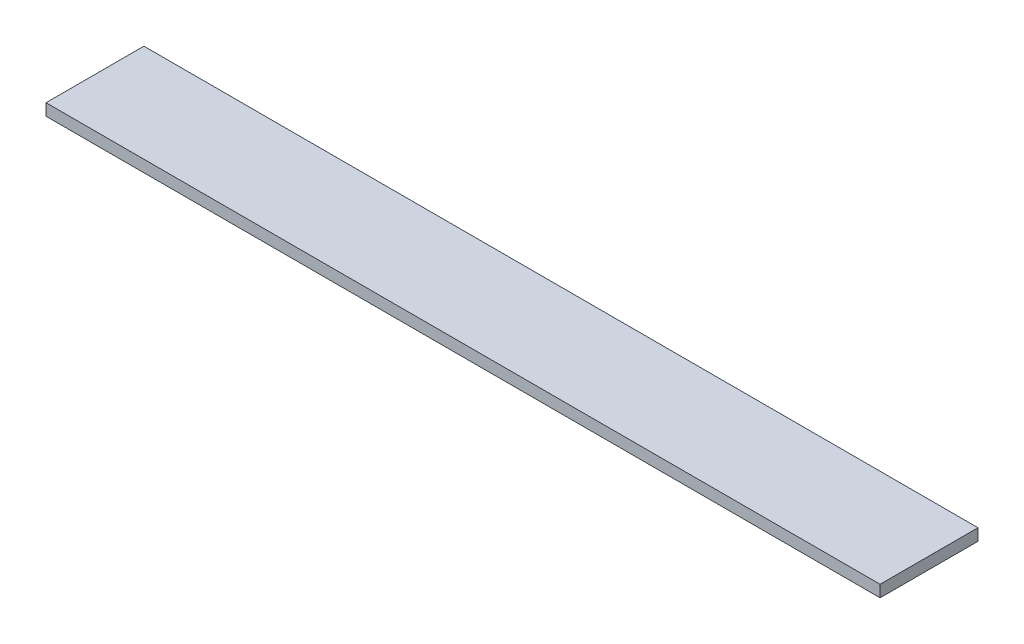
ISO-10303-21;
HEADER;
FILE_DESCRIPTION(('STEP AP214'),'2;1');
FILE_NAME('part.step','',(''),(''),'','','');
FILE_SCHEMA(('AUTOMOTIVE_DESIGN { 1 0 10303 214 1 1 1 1 }'));
ENDSEC;
DATA;
#1=APPLICATION_CONTEXT('core data for automotive mechanical design processes');
#2=APPLICATION_PROTOCOL_DEFINITION('international standard','automotive_design',2000,#1);
#3=PRODUCT_CONTEXT('',#1,'mechanical');
#4=PRODUCT('Part','Part','',(#3));
#5=PRODUCT_RELATED_PRODUCT_CATEGORY('part','',(#4));
#6=PRODUCT_DEFINITION_FORMATION('','',#4);
#7=PRODUCT_DEFINITION_CONTEXT('part definition',#1,'design');
#8=PRODUCT_DEFINITION('design','',#6,#7);
#9=PRODUCT_DEFINITION_SHAPE('','',#8);
#10=(LENGTH_UNIT() NAMED_UNIT(*) SI_UNIT(.MILLI.,.METRE.));
#11=(NAMED_UNIT(*) PLANE_ANGLE_UNIT() SI_UNIT($,.RADIAN.));
#12=(NAMED_UNIT(*) SI_UNIT($,.STERADIAN.) SOLID_ANGLE_UNIT());
#13=UNCERTAINTY_MEASURE_WITH_UNIT(LENGTH_MEASURE(1.E-05),#10,'distance_accuracy_value','');
#14=(GEOMETRIC_REPRESENTATION_CONTEXT(3) GLOBAL_UNCERTAINTY_ASSIGNED_CONTEXT((#13)) GLOBAL_UNIT_ASSIGNED_CONTEXT((#10,
#11,#12)) REPRESENTATION_CONTEXT('',''));
#15=CARTESIAN_POINT('',(0.,0.,0.));
#16=DIRECTION('',(0.,0.,1.));
#17=DIRECTION('',(1.,0.,0.));
#18=AXIS2_PLACEMENT_3D('',#15,#16,#17);
#19=CARTESIAN_POINT('',(135.255,3.81,-15.875));
#20=DIRECTION('',(-1.,0.,0.));
#21=DIRECTION('',(0.,0.,1.));
#22=AXIS2_PLACEMENT_3D('',#19,#20,#21);
#23=PLANE('',#22);
#24=DIRECTION('',(0.,0.,-1.));
#25=VECTOR('',#24,1.);
#26=CARTESIAN_POINT('',(135.255,0.,-15.875));
#27=LINE('',#26,#25);
#28=CARTESIAN_POINT('',(135.255,0.,15.875));
#29=VERTEX_POINT('',#28);
#30=CARTESIAN_POINT('',(135.255,0.,-15.875));
#31=VERTEX_POINT('',#30);
#32=EDGE_CURVE('E100',#29,#31,#27,.T.);
#33=ORIENTED_EDGE('',*,*,#32,.T.);
#34=DIRECTION('',(0.,-1.,0.));
#35=VECTOR('',#34,1.);
#36=CARTESIAN_POINT('',(135.255,3.81,-15.875));
#37=LINE('',#36,#35);
#38=CARTESIAN_POINT('',(135.255,3.81,-15.875));
#39=VERTEX_POINT('',#38);
#40=EDGE_CURVE('E11',#39,#31,#37,.T.);
#41=ORIENTED_EDGE('',*,*,#40,.F.);
#42=DIRECTION('',(0.,0.,-1.));
#43=VECTOR('',#42,1.);
#44=CARTESIAN_POINT('',(135.255,3.81,-15.875));
#45=LINE('',#44,#43);
#46=CARTESIAN_POINT('',(135.255,3.81,15.875));
#47=VERTEX_POINT('',#46);
#48=EDGE_CURVE('E88',#47,#39,#45,.T.);
#49=ORIENTED_EDGE('',*,*,#48,.F.);
#50=DIRECTION('',(0.,-1.,0.));
#51=VECTOR('',#50,1.);
#52=CARTESIAN_POINT('',(135.255,3.81,15.875));
#53=LINE('',#52,#51);
#54=EDGE_CURVE('E96',#47,#29,#53,.T.);
#55=ORIENTED_EDGE('',*,*,#54,.T.);
#56=EDGE_LOOP('',(#33,#41,#49,#55));
#57=FACE_BOUND('',#56,.T.);
#58=ADVANCED_FACE('F37',(#57),#23,.F.);
#59=CARTESIAN_POINT('',(-135.255,3.81,-15.875));
#60=DIRECTION('',(0.,0.,1.));
#61=DIRECTION('',(1.,0.,0.));
#62=AXIS2_PLACEMENT_3D('',#59,#60,#61);
#63=PLANE('',#62);
#64=DIRECTION('',(-1.,0.,0.));
#65=VECTOR('',#64,1.);
#66=CARTESIAN_POINT('',(-135.255,0.,-15.875));
#67=LINE('',#66,#65);
#68=CARTESIAN_POINT('',(-135.255,0.,-15.875));
#69=VERTEX_POINT('',#68);
#70=EDGE_CURVE('E92',#31,#69,#67,.T.);
#71=ORIENTED_EDGE('',*,*,#70,.T.);
#72=DIRECTION('',(0.,-1.,0.));
#73=VECTOR('',#72,1.);
#74=CARTESIAN_POINT('',(-135.255,3.81,-15.875));
#75=LINE('',#74,#73);
#76=CARTESIAN_POINT('',(-135.255,3.81,-15.875));
#77=VERTEX_POINT('',#76);
#78=EDGE_CURVE('E45',#77,#69,#75,.T.);
#79=ORIENTED_EDGE('',*,*,#78,.F.);
#80=DIRECTION('',(-1.,0.,0.));
#81=VECTOR('',#80,1.);
#82=CARTESIAN_POINT('',(-135.255,3.81,-15.875));
#83=LINE('',#82,#81);
#84=EDGE_CURVE('E83',#39,#77,#83,.T.);
#85=ORIENTED_EDGE('',*,*,#84,.F.);
#86=ORIENTED_EDGE('',*,*,#40,.T.);
#87=EDGE_LOOP('',(#71,#79,#85,#86));
#88=FACE_BOUND('',#87,.T.);
#89=ADVANCED_FACE('F91',(#88),#63,.F.);
#90=CARTESIAN_POINT('',(-135.255,3.81,-15.875));
#91=DIRECTION('',(1.,0.,0.));
#92=DIRECTION('',(0.,0.,-1.));
#93=AXIS2_PLACEMENT_3D('',#90,#91,#92);
#94=PLANE('',#93);
#95=DIRECTION('',(0.,0.,1.));
#96=VECTOR('',#95,1.);
#97=CARTESIAN_POINT('',(-135.255,0.,-15.875));
#98=LINE('',#97,#96);
#99=CARTESIAN_POINT('',(-135.255,0.,15.875));
#100=VERTEX_POINT('',#99);
#101=EDGE_CURVE('E70',#69,#100,#98,.T.);
#102=ORIENTED_EDGE('',*,*,#101,.T.);
#103=DIRECTION('',(0.,-1.,0.));
#104=VECTOR('',#103,1.);
#105=CARTESIAN_POINT('',(-135.255,3.81,15.875));
#106=LINE('',#105,#104);
#107=CARTESIAN_POINT('',(-135.255,3.81,15.875));
#108=VERTEX_POINT('',#107);
#109=EDGE_CURVE('E93',#108,#100,#106,.T.);
#110=ORIENTED_EDGE('',*,*,#109,.F.);
#111=DIRECTION('',(0.,0.,1.));
#112=VECTOR('',#111,1.);
#113=CARTESIAN_POINT('',(-135.255,3.81,-15.875));
#114=LINE('',#113,#112);
#115=EDGE_CURVE('E86',#77,#108,#114,.T.);
#116=ORIENTED_EDGE('',*,*,#115,.F.);
#117=ORIENTED_EDGE('',*,*,#78,.T.);
#118=EDGE_LOOP('',(#102,#110,#116,#117));
#119=FACE_BOUND('',#118,.T.);
#120=ADVANCED_FACE('F94',(#119),#94,.F.);
#121=CARTESIAN_POINT('',(-135.255,3.81,15.875));
#122=DIRECTION('',(0.,0.,-1.));
#123=DIRECTION('',(-1.,0.,0.));
#124=AXIS2_PLACEMENT_3D('',#121,#122,#123);
#125=PLANE('',#124);
#126=DIRECTION('',(1.,0.,0.));
#127=VECTOR('',#126,1.);
#128=CARTESIAN_POINT('',(-135.255,0.,15.875));
#129=LINE('',#128,#127);
#130=EDGE_CURVE('E76',#100,#29,#129,.T.);
#131=ORIENTED_EDGE('',*,*,#130,.T.);
#132=ORIENTED_EDGE('',*,*,#54,.F.);
#133=DIRECTION('',(1.,0.,0.));
#134=VECTOR('',#133,1.);
#135=CARTESIAN_POINT('',(-135.255,3.81,15.875));
#136=LINE('',#135,#134);
#137=EDGE_CURVE('E53',#108,#47,#136,.T.);
#138=ORIENTED_EDGE('',*,*,#137,.F.);
#139=ORIENTED_EDGE('',*,*,#109,.T.);
#140=EDGE_LOOP('',(#131,#132,#138,#139));
#141=FACE_BOUND('',#140,.T.);
#142=ADVANCED_FACE('F107',(#141),#125,.F.);
#143=CARTESIAN_POINT('',(0.,3.81,0.));
#144=DIRECTION('',(0.,1.,0.));
#145=DIRECTION('',(0.,0.,1.));
#146=AXIS2_PLACEMENT_3D('',#143,#144,#145);
#147=PLANE('',#146);
#148=ORIENTED_EDGE('',*,*,#48,.T.);
#149=ORIENTED_EDGE('',*,*,#84,.T.);
#150=ORIENTED_EDGE('',*,*,#115,.T.);
#151=ORIENTED_EDGE('',*,*,#137,.T.);
#152=EDGE_LOOP('',(#148,#149,#150,#151));
#153=FACE_BOUND('',#152,.T.);
#154=ADVANCED_FACE('F84',(#153),#147,.T.);
#155=CARTESIAN_POINT('',(0.,0.,0.));
#156=DIRECTION('',(0.,1.,0.));
#157=DIRECTION('',(0.,0.,1.));
#158=AXIS2_PLACEMENT_3D('',#155,#156,#157);
#159=PLANE('',#158);
#160=ORIENTED_EDGE('',*,*,#32,.F.);
#161=ORIENTED_EDGE('',*,*,#130,.F.);
#162=ORIENTED_EDGE('',*,*,#101,.F.);
#163=ORIENTED_EDGE('',*,*,#70,.F.);
#164=EDGE_LOOP('',(#160,#161,#162,#163));
#165=FACE_BOUND('',#164,.T.);
#166=ADVANCED_FACE('F110',(#165),#159,.F.);
#167=CLOSED_SHELL('',(#58,#89,#120,#142,#154,#166));
#168=MANIFOLD_SOLID_BREP('B2',#167);
#169=ADVANCED_BREP_SHAPE_REPRESENTATION('',(#18,#168),#14);
#170=SHAPE_DEFINITION_REPRESENTATION(#9,#169);
ENDSEC;
END-ISO-10303-21;
